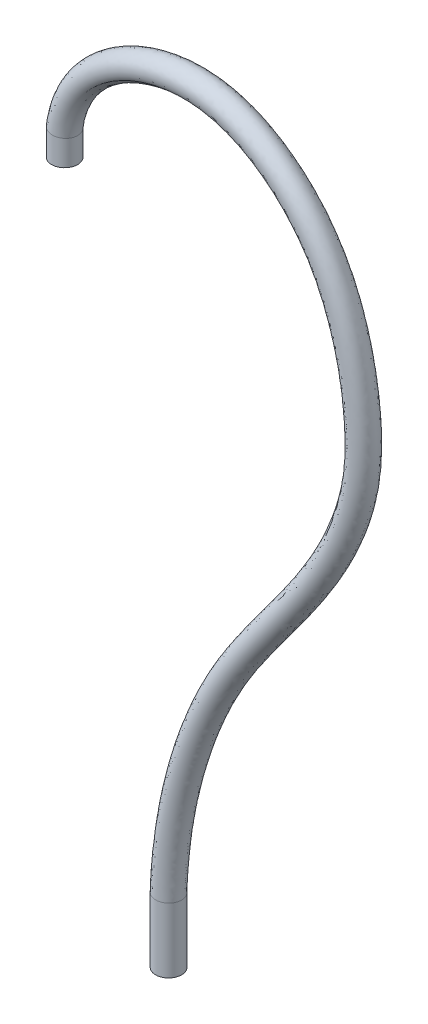
ISO-10303-21;
HEADER;
FILE_DESCRIPTION(('STEP AP214'),'2;1');
FILE_NAME('part.step','',(''),(''),'','','');
FILE_SCHEMA(('AUTOMOTIVE_DESIGN { 1 0 10303 214 1 1 1 1 }'));
ENDSEC;
DATA;
#1=APPLICATION_CONTEXT('core data for automotive mechanical design processes');
#2=APPLICATION_PROTOCOL_DEFINITION('international standard','automotive_design',2000,#1);
#3=PRODUCT_CONTEXT('',#1,'mechanical');
#4=PRODUCT('Part','Part','',(#3));
#5=PRODUCT_RELATED_PRODUCT_CATEGORY('part','',(#4));
#6=PRODUCT_DEFINITION_FORMATION('','',#4);
#7=PRODUCT_DEFINITION_CONTEXT('part definition',#1,'design');
#8=PRODUCT_DEFINITION('design','',#6,#7);
#9=PRODUCT_DEFINITION_SHAPE('','',#8);
#10=(LENGTH_UNIT() NAMED_UNIT(*) SI_UNIT(.MILLI.,.METRE.));
#11=(NAMED_UNIT(*) PLANE_ANGLE_UNIT() SI_UNIT($,.RADIAN.));
#12=(NAMED_UNIT(*) SI_UNIT($,.STERADIAN.) SOLID_ANGLE_UNIT());
#13=UNCERTAINTY_MEASURE_WITH_UNIT(LENGTH_MEASURE(1.E-05),#10,'distance_accuracy_value','');
#14=(GEOMETRIC_REPRESENTATION_CONTEXT(3) GLOBAL_UNCERTAINTY_ASSIGNED_CONTEXT((#13)) GLOBAL_UNIT_ASSIGNED_CONTEXT((#10,
#11,#12)) REPRESENTATION_CONTEXT('',''));
#15=CARTESIAN_POINT('',(0.,0.,0.));
#16=DIRECTION('',(0.,0.,1.));
#17=DIRECTION('',(1.,0.,0.));
#18=AXIS2_PLACEMENT_3D('',#15,#16,#17);
#19=CARTESIAN_POINT('',(8.,-50.,0.));
#20=DIRECTION('',(0.,-1.,0.));
#21=DIRECTION('',(0.,0.,1.));
#22=AXIS2_PLACEMENT_3D('',#19,#20,#21);
#23=PLANE('',#22);
#24=CARTESIAN_POINT('',(8.,-50.,0.));
#25=DIRECTION('',(0.,-1.,0.));
#26=DIRECTION('',(0.,0.,1.));
#27=AXIS2_PLACEMENT_3D('',#24,#25,#26);
#28=CIRCLE('',#27,1.);
#29=CARTESIAN_POINT('',(8.,-50.,1.));
#30=VERTEX_POINT('',#29);
#31=EDGE_CURVE('E42',#30,#30,#28,.T.);
#32=ORIENTED_EDGE('',*,*,#31,.T.);
#33=EDGE_LOOP('',(#32));
#34=FACE_BOUND('',#33,.T.);
#35=ADVANCED_FACE('F39',(#34),#23,.T.);
#36=CARTESIAN_POINT('',(0.,0.,0.));
#37=DIRECTION('',(0.,1.,0.));
#38=DIRECTION('',(0.,0.,1.));
#39=AXIS2_PLACEMENT_3D('',#36,#37,#38);
#40=PLANE('',#39);
#41=CARTESIAN_POINT('',(0.,0.,0.));
#42=DIRECTION('',(0.,1.,0.));
#43=DIRECTION('',(0.,0.,1.));
#44=AXIS2_PLACEMENT_3D('',#41,#42,#43);
#45=CIRCLE('',#44,1.);
#46=CARTESIAN_POINT('',(0.,0.,1.));
#47=VERTEX_POINT('',#46);
#48=EDGE_CURVE('E72',#47,#47,#45,.T.);
#49=ORIENTED_EDGE('',*,*,#48,.F.);
#50=EDGE_LOOP('',(#49));
#51=FACE_BOUND('',#50,.T.);
#52=ADVANCED_FACE('F129',(#51),#40,.F.);
#53=CARTESIAN_POINT('',(8.,-44.8,0.));
#54=DIRECTION('',(0.,-1.,0.));
#55=DIRECTION('',(0.,0.,-1.));
#56=AXIS2_PLACEMENT_3D('',#53,#54,#55);
#57=CYLINDRICAL_SURFACE('',#56,1.);
#58=CARTESIAN_POINT('',(8.,-45.,1.));
#59=CARTESIAN_POINT('',(7.98805481461004,-44.9998140617509,1.00000165148446));
#60=CARTESIAN_POINT('',(7.97610338253314,-44.9996280264795,0.999787081348416));
#61=CARTESIAN_POINT('',(7.90806474949074,-44.9985689424073,0.997340093052473));
#62=CARTESIAN_POINT('',(7.85204433235093,-44.9976969375508,0.990581500069308));
#63=CARTESIAN_POINT('',(7.76950194526793,-44.9964121022962,0.973482363838396));
#64=CARTESIAN_POINT('',(7.74219800479639,-44.9959870967062,0.966607655404486));
#65=CARTESIAN_POINT('',(7.68823970496654,-44.9951471987255,0.95057746785115));
#66=CARTESIAN_POINT('',(7.6615858925841,-44.9947323148506,0.941420136329535));
#67=CARTESIAN_POINT('',(7.58302341751744,-44.9935094417863,0.910650575818504));
#68=CARTESIAN_POINT('',(7.53237427841093,-44.9927210606928,0.885711744000511));
#69=CARTESIAN_POINT('',(7.43600570680112,-44.9912210380202,0.827694263162769));
#70=CARTESIAN_POINT('',(7.39028645275961,-44.9905093992193,0.79461531961325));
#71=CARTESIAN_POINT('',(7.30504919930706,-44.989182651144,0.721251079430236));
#72=CARTESIAN_POINT('',(7.26553039235925,-44.9885675292994,0.680966722683669));
#73=CARTESIAN_POINT('',(7.19381459217932,-44.987451254809,0.594330153932255));
#74=CARTESIAN_POINT('',(7.16161837757424,-44.9869501142832,0.547977297475663));
#75=CARTESIAN_POINT('',(7.10547001872057,-44.9860761555701,0.450530275803133));
#76=CARTESIAN_POINT('',(7.08151654302461,-44.9857033166584,0.399436878019983));
#77=CARTESIAN_POINT('',(7.04252793180941,-44.9850964546881,0.293953969625149));
#78=CARTESIAN_POINT('',(7.02749264448783,-44.9848624292668,0.23956451513519));
#79=CARTESIAN_POINT('',(7.00676779554279,-44.9845398455239,0.129038228212518));
#80=CARTESIAN_POINT('',(7.00107733950231,-44.9844512732806,0.0729015635337563));
#81=CARTESIAN_POINT('',(6.99920108791111,-44.9844220693183,-0.0395304363150781));
#82=CARTESIAN_POINT('',(7.00301529393838,-44.9844814376237,-0.0958257715114917));
#83=CARTESIAN_POINT('',(7.02003945836991,-44.9847464198699,-0.206973646647821));
#84=CARTESIAN_POINT('',(7.03324887367382,-44.9849520253572,-0.261826269795236));
#85=CARTESIAN_POINT('',(7.06868822357359,-44.9855036423591,-0.368536496549264));
#86=CARTESIAN_POINT('',(7.09091837568119,-44.9858496572592,-0.420394027902537));
#87=CARTESIAN_POINT('',(7.1437701108498,-44.9866723027374,-0.519646003420861));
#88=CARTESIAN_POINT('',(7.17439259574509,-44.9871489473528,-0.567039967198166));
#89=CARTESIAN_POINT('',(7.24315433087011,-44.9882192398369,-0.656006340521134));
#90=CARTESIAN_POINT('',(7.28129227637592,-44.9888128673968,-0.697579758404735));
#91=CARTESIAN_POINT('',(7.36400817045119,-44.9901003678044,-0.773742477416914));
#92=CARTESIAN_POINT('',(7.40858774381729,-44.9907942659439,-0.808330011175433));
#93=CARTESIAN_POINT('',(7.50294900118573,-44.9922630414151,-0.869539990287673));
#94=CARTESIAN_POINT('',(7.5527312364656,-44.9930379273285,-0.896161590408816));
#95=CARTESIAN_POINT('',(7.63279582548675,-44.9942841794463,-0.930657164096869));
#96=CARTESIAN_POINT('',(7.66179961957667,-44.9947356415661,-0.941582319051211));
#97=CARTESIAN_POINT('',(7.72066380072263,-44.9956519016473,-0.960692259162903));
#98=CARTESIAN_POINT('',(7.75052350046273,-44.9961166889083,-0.968879179774275));
#99=CARTESIAN_POINT('',(7.84093545232383,-44.9975240185615,-0.989187675282089));
#100=CARTESIAN_POINT('',(7.90251145145315,-44.9984825002033,-0.997138991959235));
#101=CARTESIAN_POINT('',(7.97610403076557,-44.9996280365702,-0.999787371859265));
#102=CARTESIAN_POINT('',(7.98805547934945,-44.9998140720989,-1.00000197221012));
#103=CARTESIAN_POINT('',(8.,-45.0000000000019,-1.));
#104=B_SPLINE_CURVE_WITH_KNOTS('',3,(#58,#59,#60,#61,#62,#63,#64,#65,#66,#67,#68,#69,#70,#71,
#72,#73,#74,#75,#76,#77,#78,#79,#80,#81,#82,#83,#84,#85,#86,#87,#88,#89,#90,#91,#92,#93,#94,#95,
#96,#97,#98,#99,#100,#101,#102,#103),.UNSPECIFIED.,.F.,.F.,(4,2,2,2,2,2,2,2,2,2,2,2,2,2,2,2,2,2,
2,2,2,2,4),(0.,0.0358549768613409,0.20417400548127,0.288574467277851,0.373043646297481,
0.54156014186658,0.710082735684229,0.878583363124709,1.04710189923227,1.21559320179453,
1.38408163627292,1.55255394336417,1.72102627842559,1.88948887555068,2.05795553495712,
2.22644030477775,2.39489585047393,2.56339396077412,2.73190994338379,2.82477657315231,
2.91757060966215,3.10254423959273,3.13839921645405),.UNSPECIFIED.);
#105=CARTESIAN_POINT('',(8.,-45.0000000000019,-1.));
#106=VERTEX_POINT('',#105);
#107=CARTESIAN_POINT('',(8.,-45.,1.));
#108=VERTEX_POINT('',#107);
#109=EDGE_CURVE('E63',#106,#108,#104,.F.);
#110=ORIENTED_EDGE('',*,*,#109,.F.);
#111=CARTESIAN_POINT('',(8.,-45.,1.));
#112=CARTESIAN_POINT('',(8.01194518542314,-45.0001859373805,1.00000165147832));
#113=CARTESIAN_POINT('',(8.0238966167728,-45.0003720187773,0.999787081344606));
#114=CARTESIAN_POINT('',(8.09193537001394,-45.0014316301983,0.997340088888409));
#115=CARTESIAN_POINT('',(8.14795589262842,-45.0023050867706,0.990581471675548));
#116=CARTESIAN_POINT('',(8.23049841070236,-45.0035934938564,0.973482280923822));
#117=CARTESIAN_POINT('',(8.25780239060565,-45.0040199254693,0.966607551138434));
#118=CARTESIAN_POINT('',(8.31176076092567,-45.0048630971601,0.950577316241468));
#119=CARTESIAN_POINT('',(8.33841460436052,-45.0052798290647,0.941419958726742));
#120=CARTESIAN_POINT('',(8.41697715720728,-45.006508795508,0.91065031682549));
#121=CARTESIAN_POINT('',(8.46762633196894,-45.0073019777447,0.885711425241722));
#122=CARTESIAN_POINT('',(8.5639949549771,-45.008812535628,0.827693815970666));
#123=CARTESIAN_POINT('',(8.60971422475939,-45.0095299085302,0.794614803750466));
#124=CARTESIAN_POINT('',(8.69495153772968,-45.010868410939,0.721250377821417));
#125=CARTESIAN_POINT('',(8.73447038249966,-45.0114895528861,0.680965897068476));
#126=CARTESIAN_POINT('',(8.80618622946308,-45.0126174778433,0.594329050850721));
#127=CARTESIAN_POINT('',(8.83838245307585,-45.0131242486927,0.547976040971881));
#128=CARTESIAN_POINT('',(8.89453074764769,-45.0140084463238,0.450528760674803));
#129=CARTESIAN_POINT('',(8.9184841628689,-45.0143858941958,0.399435265076509));
#130=CARTESIAN_POINT('',(8.95747263026617,-45.0150004404644,0.293952152093126));
#131=CARTESIAN_POINT('',(8.97250783441286,-45.0152375412525,0.239562590891998));
#132=CARTESIAN_POINT('',(8.99323245469438,-45.0155643990917,0.129036263982315));
#133=CARTESIAN_POINT('',(8.99892279400049,-45.0156541706973,0.0728996714198654));
#134=CARTESIAN_POINT('',(9.00079883904247,-45.0156837652316,-0.039532167168209));
#135=CARTESIAN_POINT('',(8.99698454332149,-45.0156235881373,-0.0958274132181504));
#136=CARTESIAN_POINT('',(8.97996024643171,-45.0153550702976,-0.206974994758923));
#137=CARTESIAN_POINT('',(8.96675080444664,-45.0151467383702,-0.261827415922853));
#138=CARTESIAN_POINT('',(8.9313114726738,-45.0145880540145,-0.368537234237228));
#139=CARTESIAN_POINT('',(8.90908136533917,-45.0142376981611,-0.420394559121982));
#140=CARTESIAN_POINT('',(8.8562297622477,-45.013405238977,-0.51964619685407));
#141=CARTESIAN_POINT('',(8.82560735417795,-45.0129231213227,-0.567040023728984));
#142=CARTESIAN_POINT('',(8.75684582665658,-45.0118413639366,-0.656006144965132));
#143=CARTESIAN_POINT('',(8.7187080117253,-45.0112417446007,-0.697579447510754));
#144=CARTESIAN_POINT('',(8.63599221387168,-45.0099424084731,-0.773742169193506));
#145=CARTESIAN_POINT('',(8.59141257390846,-45.0092426659268,-0.80832978588598));
#146=CARTESIAN_POINT('',(8.49705115977489,-45.0077630105988,-0.869539905044896));
#147=CARTESIAN_POINT('',(8.44726883428902,-45.0069830893208,-0.896161562221527));
#148=CARTESIAN_POINT('',(8.36720415519657,-45.0057301038672,-0.930657171151228));
#149=CARTESIAN_POINT('',(8.3382003739595,-45.0052764608684,-0.941582321020394));
#150=CARTESIAN_POINT('',(8.27933621307339,-45.0043563318823,-0.960692254813463));
#151=CARTESIAN_POINT('',(8.24947652074768,-45.0038898562116,-0.968879174197902));
#152=CARTESIAN_POINT('',(8.15906458040834,-45.0024783041028,-0.989187669539582));
#153=CARTESIAN_POINT('',(8.09748857367861,-45.001518114485,-0.997138991237222));
#154=CARTESIAN_POINT('',(8.02389596855879,-45.0003720085532,-0.99978737184792));
#155=CARTESIAN_POINT('',(8.01194452070349,-45.0001859268801,-1.00000197219544));
#156=CARTESIAN_POINT('',(8.,-45.0000000000019,-1.));
#157=B_SPLINE_CURVE_WITH_KNOTS('',3,(#111,#112,#113,#114,#115,#116,#117,#118,#119,#120,#121,
#122,#123,#124,#125,#126,#127,#128,#129,#130,#131,#132,#133,#134,#135,#136,#137,#138,#139,#140,
#141,#142,#143,#144,#145,#146,#147,#148,#149,#150,#151,#152,#153,#154,#155,#156),.UNSPECIFIED.,
.F.,.F.,(4,2,2,2,2,2,2,2,2,2,2,2,2,2,2,2,2,2,2,2,2,2,4),(0.,0.0358549768602243,
0.204174390891306,0.288575047660511,0.373044421707198,0.541561293973049,0.710084264559417,
0.878585430756969,1.04710450454294,1.21559608268947,1.38408478957551,1.55255685060353,
1.72102893745486,1.88949099796246,2.05795712142647,2.22644156582868,2.39489679051027,
2.56339542458947,2.73191193218545,2.82477861654628,2.91757270728109,3.10254644171763,
3.13840141857784),.UNSPECIFIED.);
#158=EDGE_CURVE('E65',#106,#108,#157,.F.);
#159=ORIENTED_EDGE('',*,*,#158,.T.);
#160=EDGE_LOOP('',(#110,#159));
#161=FACE_BOUND('',#160,.T.);
#162=ORIENTED_EDGE('',*,*,#31,.F.);
#163=EDGE_LOOP('',(#162));
#164=FACE_BOUND('',#163,.T.);
#165=ADVANCED_FACE('F66',(#161,#164),#57,.T.);
#166=CARTESIAN_POINT('',(-0.0306229319689422,1.76137151981467,1.));
#167=CARTESIAN_POINT('',(-0.0204152879792942,1.84091434654313,1.));
#168=CARTESIAN_POINT('',(-0.0102100034091478,1.92045814668702,1.));
#169=CARTESIAN_POINT('',(0.0212547068439375,2.16558650435672,1.));
#170=CARTESIAN_POINT('',(0.047419682039352,2.32914728727976,1.));
#171=CARTESIAN_POINT('',(0.109246799790766,2.652091005692,1.));
#172=CARTESIAN_POINT('',(0.144904031832794,2.81147596798519,1.));
#173=CARTESIAN_POINT('',(0.265577485650926,3.28319879424991,1.));
#174=CARTESIAN_POINT('',(0.364295469577643,3.58910459904989,1.));
#175=CARTESIAN_POINT('',(0.711022397210815,4.47972282478102,1.));
#176=CARTESIAN_POINT('',(1.00960432599683,5.03733606002943,1.));
#177=CARTESIAN_POINT('',(2.07376955109829,6.59081143322531,1.));
#178=CARTESIAN_POINT('',(3.00777230508657,7.46730924474106,1.));
#179=CARTESIAN_POINT('',(6.21247855286938,9.53160470927009,1.));
#180=CARTESIAN_POINT('',(8.88588006889423,10.1542044021796,1.));
#181=CARTESIAN_POINT('',(12.8325925278302,9.57518327519314,1.));
#182=CARTESIAN_POINT('',(14.2277189977555,9.02145276159828,1.));
#183=CARTESIAN_POINT('',(16.7602734648448,7.44947859842006,1.));
#184=CARTESIAN_POINT('',(17.8977014683981,6.43123493983376,1.));
#185=CARTESIAN_POINT('',(21.1504711774338,2.4908213511582,1.));
#186=CARTESIAN_POINT('',(22.2988215651818,-1.05410786993432,1.));
#187=CARTESIAN_POINT('',(23.0026577057096,-6.33399612996956,1.));
#188=CARTESIAN_POINT('',(23.077126577792,-8.04582177217757,1.));
#189=CARTESIAN_POINT('',(22.4333647161719,-13.0736579630502,1.));
#190=CARTESIAN_POINT('',(20.8394202602341,-16.2653874038234,1.));
#191=CARTESIAN_POINT('',(16.9668331568098,-22.171302539669,1.));
#192=CARTESIAN_POINT('',(14.6624665428578,-24.860100377207,1.));
#193=CARTESIAN_POINT('',(11.3359405010715,-30.4474380385006,1.));
#194=CARTESIAN_POINT('',(10.1681203185673,-33.244563219975,1.));
#195=CARTESIAN_POINT('',(8.95167828380848,-37.5924654184224,1.));
#196=CARTESIAN_POINT('',(8.63541231175747,-39.0671352233303,1.));
#197=CARTESIAN_POINT('',(8.29580078170953,-41.2903064226676,1.));
#198=CARTESIAN_POINT('',(8.20506150967735,-42.0332245717703,1.));
#199=CARTESIAN_POINT('',(8.06867300307515,-43.5183018479195,1.));
#200=CARTESIAN_POINT('',(8.02302886501342,-44.2604603856005,1.));
#201=CARTESIAN_POINT('',(7.99792503959598,-45.0666344353569,1.));
#202=CARTESIAN_POINT('',(7.99585099761325,-45.13326876437,1.));
#203=CARTESIAN_POINT('',(7.99377649641968,-45.1999031465565,1.));
#204=CARTESIAN_POINT('',(1.95310941182559,1.50680131695611,1.));
#205=CARTESIAN_POINT('',(1.96331705581524,1.58634414368455,1.));
#206=CARTESIAN_POINT('',(1.97477755717229,1.67566443229557,1.));
#207=CARTESIAN_POINT('',(2.0023739991279,1.890664065754,1.));
#208=CARTESIAN_POINT('',(2.01944818284606,1.99331704436174,1.));
#209=CARTESIAN_POINT('',(2.06586865393284,2.23578669378566,1.));
#210=CARTESIAN_POINT('',(2.0925997304692,2.35525327119271,1.));
#211=CARTESIAN_POINT('',(2.1830018023211,2.70864268288023,1.));
#212=CARTESIAN_POINT('',(2.2568674407412,2.93757894586335,1.));
#213=CARTESIAN_POINT('',(2.5171100085068,3.60604959328318,1.));
#214=CARTESIAN_POINT('',(2.74219005962151,4.02762980030223,1.));
#215=CARTESIAN_POINT('',(3.55856830395016,5.2193841127417,1.));
#216=CARTESIAN_POINT('',(4.29466017941635,5.91724109761524,1.));
#217=CARTESIAN_POINT('',(6.8878434752451,7.58762711703736,1.));
#218=CARTESIAN_POINT('',(9.1223603805899,8.09810128152666,1.));
#219=CARTESIAN_POINT('',(12.2333286727273,7.64169195734007,1.));
#220=CARTESIAN_POINT('',(13.3746160997315,7.19702374004102,1.));
#221=CARTESIAN_POINT('',(15.5038824791974,5.87537329548496,1.));
#222=CARTESIAN_POINT('',(16.4864341300938,4.99919463351919,1.));
#223=CARTESIAN_POINT('',(19.2872455542616,1.60628447283399,1.));
#224=CARTESIAN_POINT('',(20.349084240438,-1.56387582606753,1.));
#225=CARTESIAN_POINT('',(21.0045862122346,-6.48118109767011,1.));
#226=CARTESIAN_POINT('',(21.0640430630053,-8.02048613156399,1.));
#227=CARTESIAN_POINT('',(20.5083830507365,-12.3602392100134,1.));
#228=CARTESIAN_POINT('',(19.0787329794664,-15.3031812679251,1.));
#229=CARTESIAN_POINT('',(15.3861736451532,-20.9345438369283,1.));
#230=CARTESIAN_POINT('',(13.0607065618377,-23.6409083752467,1.));
#231=CARTESIAN_POINT('',(9.51929576984431,-29.5891732153839,1.));
#232=CARTESIAN_POINT('',(8.2863608967651,-32.5474322845738,1.));
#233=CARTESIAN_POINT('',(7.00349854688533,-37.1327391646898,1.));
#234=CARTESIAN_POINT('',(6.67042707355036,-38.6860419338211,1.));
#235=CARTESIAN_POINT('',(6.31269586185977,-41.0278285239878,1.));
#236=CARTESIAN_POINT('',(6.21710867839955,-41.8104015099355,1.));
#237=CARTESIAN_POINT('',(6.07338879483753,-43.375307076629,1.));
#238=CARTESIAN_POINT('',(6.02462944789715,-44.1779324775329,1.));
#239=CARTESIAN_POINT('',(5.99883662482826,-45.0062278399223,1.));
#240=CARTESIAN_POINT('',(5.99681953204835,-45.0710337285668,1.));
#241=CARTESIAN_POINT('',(5.99474503085478,-45.1376681107533,1.));
#242=CARTESIAN_POINT('',(1.95310941182559,1.50680131695611,-1.));
#243=CARTESIAN_POINT('',(1.96331705581524,1.58634414368455,-1.));
#244=CARTESIAN_POINT('',(1.97477755717229,1.67566443229557,-1.));
#245=CARTESIAN_POINT('',(2.0023739991279,1.890664065754,-1.));
#246=CARTESIAN_POINT('',(2.01944818284606,1.99331704436174,-1.));
#247=CARTESIAN_POINT('',(2.06586865393284,2.23578669378566,-1.));
#248=CARTESIAN_POINT('',(2.0925997304692,2.35525327119271,-1.));
#249=CARTESIAN_POINT('',(2.1830018023211,2.70864268288023,-1.));
#250=CARTESIAN_POINT('',(2.2568674407412,2.93757894586335,-1.));
#251=CARTESIAN_POINT('',(2.5171100085068,3.60604959328318,-1.));
#252=CARTESIAN_POINT('',(2.74219005962151,4.02762980030223,-1.));
#253=CARTESIAN_POINT('',(3.55856830395016,5.2193841127417,-1.));
#254=CARTESIAN_POINT('',(4.29466017941635,5.91724109761524,-1.));
#255=CARTESIAN_POINT('',(6.8878434752451,7.58762711703736,-1.));
#256=CARTESIAN_POINT('',(9.1223603805899,8.09810128152666,-1.));
#257=CARTESIAN_POINT('',(12.2333286727273,7.64169195734007,-1.));
#258=CARTESIAN_POINT('',(13.3746160997315,7.19702374004102,-1.));
#259=CARTESIAN_POINT('',(15.5038824791974,5.87537329548496,-1.));
#260=CARTESIAN_POINT('',(16.4864341300938,4.99919463351919,-1.));
#261=CARTESIAN_POINT('',(19.2872455542616,1.60628447283399,-1.));
#262=CARTESIAN_POINT('',(20.349084240438,-1.56387582606753,-1.));
#263=CARTESIAN_POINT('',(21.0045862122346,-6.48118109767011,-1.));
#264=CARTESIAN_POINT('',(21.0640430630053,-8.02048613156399,-1.));
#265=CARTESIAN_POINT('',(20.5083830507365,-12.3602392100134,-1.));
#266=CARTESIAN_POINT('',(19.0787329794664,-15.3031812679251,-1.));
#267=CARTESIAN_POINT('',(15.3861736451532,-20.9345438369283,-1.));
#268=CARTESIAN_POINT('',(13.0607065618377,-23.6409083752467,-1.));
#269=CARTESIAN_POINT('',(9.51929576984431,-29.5891732153839,-1.));
#270=CARTESIAN_POINT('',(8.2863608967651,-32.5474322845738,-1.));
#271=CARTESIAN_POINT('',(7.00349854688533,-37.1327391646898,-1.));
#272=CARTESIAN_POINT('',(6.67042707355036,-38.6860419338211,-1.));
#273=CARTESIAN_POINT('',(6.31269586185977,-41.0278285239878,-1.));
#274=CARTESIAN_POINT('',(6.21710867839955,-41.8104015099355,-1.));
#275=CARTESIAN_POINT('',(6.07338879483753,-43.375307076629,-1.));
#276=CARTESIAN_POINT('',(6.02462944789715,-44.1779324775329,-1.));
#277=CARTESIAN_POINT('',(5.99883662482826,-45.0062278399223,-1.));
#278=CARTESIAN_POINT('',(5.99681953204835,-45.0710337285668,-1.));
#279=CARTESIAN_POINT('',(5.99474503085478,-45.1376681107533,-1.));
#280=CARTESIAN_POINT('',(-0.0306229319689421,1.76137151981467,-1.));
#281=CARTESIAN_POINT('',(-0.0204152879792941,1.84091434654313,-1.));
#282=CARTESIAN_POINT('',(-0.0102100034091477,1.92045814668702,-1.));
#283=CARTESIAN_POINT('',(0.0212547068439376,2.16558650435672,-1.));
#284=CARTESIAN_POINT('',(0.0474196820393522,2.32914728727976,-1.));
#285=CARTESIAN_POINT('',(0.109246799790766,2.652091005692,-1.));
#286=CARTESIAN_POINT('',(0.144904031832794,2.81147596798519,-1.));
#287=CARTESIAN_POINT('',(0.265577485650927,3.28319879424991,-1.));
#288=CARTESIAN_POINT('',(0.364295469577643,3.58910459904989,-1.));
#289=CARTESIAN_POINT('',(0.711022397210815,4.47972282478102,-1.));
#290=CARTESIAN_POINT('',(1.00960432599683,5.03733606002943,-1.));
#291=CARTESIAN_POINT('',(2.07376955109829,6.59081143322531,-1.));
#292=CARTESIAN_POINT('',(3.00777230508657,7.46730924474106,-1.));
#293=CARTESIAN_POINT('',(6.21247855286938,9.53160470927009,-1.));
#294=CARTESIAN_POINT('',(8.88588006889423,10.1542044021796,-1.));
#295=CARTESIAN_POINT('',(12.8325925278302,9.57518327519314,-1.));
#296=CARTESIAN_POINT('',(14.2277189977555,9.02145276159828,-1.));
#297=CARTESIAN_POINT('',(16.7602734648448,7.44947859842006,-1.));
#298=CARTESIAN_POINT('',(17.8977014683981,6.43123493983376,-1.));
#299=CARTESIAN_POINT('',(21.1504711774338,2.4908213511582,-1.));
#300=CARTESIAN_POINT('',(22.2988215651818,-1.05410786993432,-1.));
#301=CARTESIAN_POINT('',(23.0026577057096,-6.33399612996956,-1.));
#302=CARTESIAN_POINT('',(23.077126577792,-8.04582177217757,-1.));
#303=CARTESIAN_POINT('',(22.4333647161719,-13.0736579630502,-1.));
#304=CARTESIAN_POINT('',(20.8394202602341,-16.2653874038234,-1.));
#305=CARTESIAN_POINT('',(16.9668331568098,-22.171302539669,-1.));
#306=CARTESIAN_POINT('',(14.6624665428578,-24.860100377207,-1.));
#307=CARTESIAN_POINT('',(11.3359405010715,-30.4474380385006,-1.));
#308=CARTESIAN_POINT('',(10.1681203185673,-33.244563219975,-1.));
#309=CARTESIAN_POINT('',(8.95167828380848,-37.5924654184224,-1.));
#310=CARTESIAN_POINT('',(8.63541231175747,-39.0671352233303,-1.));
#311=CARTESIAN_POINT('',(8.29580078170953,-41.2903064226676,-1.));
#312=CARTESIAN_POINT('',(8.20506150967735,-42.0332245717703,-1.));
#313=CARTESIAN_POINT('',(8.06867300307515,-43.5183018479195,-1.));
#314=CARTESIAN_POINT('',(8.02302886501342,-44.2604603856005,-1.));
#315=CARTESIAN_POINT('',(7.99792503959598,-45.0666344353569,-1.));
#316=CARTESIAN_POINT('',(7.99585099761325,-45.13326876437,-1.));
#317=CARTESIAN_POINT('',(7.99377649641968,-45.1999031465565,-1.));
#318=CARTESIAN_POINT('',(-2.01435527576347,2.01594172267323,-1.));
#319=CARTESIAN_POINT('',(-2.00414763177383,2.0954845494017,-1.));
#320=CARTESIAN_POINT('',(-1.99519756399058,2.16525186107847,-1.));
#321=CARTESIAN_POINT('',(-1.95986458544002,2.44050894295944,-1.));
#322=CARTESIAN_POINT('',(-1.92460881876735,2.66497753019778,-1.));
#323=CARTESIAN_POINT('',(-1.8473750543513,3.06839531759835,-1.));
#324=CARTESIAN_POINT('',(-1.80279166680362,3.26769866477767,-1.));
#325=CARTESIAN_POINT('',(-1.65184683101925,3.8577549056196,-1.));
#326=CARTESIAN_POINT('',(-1.52827650158592,4.24063025223643,-1.));
#327=CARTESIAN_POINT('',(-1.09506521408517,5.35339605627886,-1.));
#328=CARTESIAN_POINT('',(-0.722981407627861,6.04704231975663,-1.));
#329=CARTESIAN_POINT('',(0.588970798246424,7.96223875370893,-1.));
#330=CARTESIAN_POINT('',(1.72088443075678,9.01737739186687,-1.));
#331=CARTESIAN_POINT('',(5.53711363049366,11.4755823015028,-1.));
#332=CARTESIAN_POINT('',(8.64939975719857,12.2103075228325,-1.));
#333=CARTESIAN_POINT('',(13.4318563829331,11.5086745930462,-1.));
#334=CARTESIAN_POINT('',(15.0808218957795,10.8458817831555,-1.));
#335=CARTESIAN_POINT('',(18.0166644504923,9.02358390135516,-1.));
#336=CARTESIAN_POINT('',(19.3089688067024,7.86327524614832,-1.));
#337=CARTESIAN_POINT('',(23.0136968006059,3.37535822948241,-1.));
#338=CARTESIAN_POINT('',(24.2485588899256,-0.544339913801108,-1.));
#339=CARTESIAN_POINT('',(25.0007291991846,-6.18681116226901,-1.));
#340=CARTESIAN_POINT('',(25.0902100925788,-8.07115741279116,-1.));
#341=CARTESIAN_POINT('',(24.3583463816072,-13.787076716087,-1.));
#342=CARTESIAN_POINT('',(22.6001075410019,-17.2275935397217,-1.));
#343=CARTESIAN_POINT('',(18.5474926684663,-23.4080612424097,-1.));
#344=CARTESIAN_POINT('',(16.2642265238779,-26.0792923791672,-1.));
#345=CARTESIAN_POINT('',(13.1525852322986,-31.3057028616173,-1.));
#346=CARTESIAN_POINT('',(12.0498797403695,-33.9416941553763,-1.));
#347=CARTESIAN_POINT('',(10.8998580207316,-38.052191672155,-1.));
#348=CARTESIAN_POINT('',(10.6003975499646,-39.4482285128396,-1.));
#349=CARTESIAN_POINT('',(10.2789057015593,-41.5527843213475,-1.));
#350=CARTESIAN_POINT('',(10.1930143409551,-42.2560476336051,-1.));
#351=CARTESIAN_POINT('',(10.0639572113128,-43.6612966192099,-1.));
#352=CARTESIAN_POINT('',(10.0214282821297,-44.3429882936681,-1.));
#353=CARTESIAN_POINT('',(9.99701345436371,-45.1270410307916,-1.));
#354=CARTESIAN_POINT('',(9.99488246317816,-45.1955038001731,-1.));
#355=CARTESIAN_POINT('',(9.99280796198459,-45.2621381823597,-1.));
#356=CARTESIAN_POINT('',(-2.01435527576347,2.01594172267323,1.));
#357=CARTESIAN_POINT('',(-2.00414763177383,2.0954845494017,1.));
#358=CARTESIAN_POINT('',(-1.99519756399058,2.16525186107847,1.));
#359=CARTESIAN_POINT('',(-1.95986458544002,2.44050894295944,1.));
#360=CARTESIAN_POINT('',(-1.92460881876735,2.66497753019778,1.));
#361=CARTESIAN_POINT('',(-1.8473750543513,3.06839531759835,1.));
#362=CARTESIAN_POINT('',(-1.80279166680362,3.26769866477767,1.));
#363=CARTESIAN_POINT('',(-1.65184683101925,3.8577549056196,1.));
#364=CARTESIAN_POINT('',(-1.52827650158592,4.24063025223643,1.));
#365=CARTESIAN_POINT('',(-1.09506521408517,5.35339605627886,1.));
#366=CARTESIAN_POINT('',(-0.722981407627861,6.04704231975663,1.));
#367=CARTESIAN_POINT('',(0.588970798246424,7.96223875370893,1.));
#368=CARTESIAN_POINT('',(1.72088443075678,9.01737739186687,1.));
#369=CARTESIAN_POINT('',(5.53711363049366,11.4755823015028,1.));
#370=CARTESIAN_POINT('',(8.64939975719857,12.2103075228325,1.));
#371=CARTESIAN_POINT('',(13.4318563829331,11.5086745930462,1.));
#372=CARTESIAN_POINT('',(15.0808218957795,10.8458817831555,1.));
#373=CARTESIAN_POINT('',(18.0166644504923,9.02358390135516,1.));
#374=CARTESIAN_POINT('',(19.3089688067024,7.86327524614832,1.));
#375=CARTESIAN_POINT('',(23.0136968006059,3.37535822948241,1.));
#376=CARTESIAN_POINT('',(24.2485588899256,-0.544339913801108,1.));
#377=CARTESIAN_POINT('',(25.0007291991846,-6.18681116226901,1.));
#378=CARTESIAN_POINT('',(25.0902100925788,-8.07115741279116,1.));
#379=CARTESIAN_POINT('',(24.3583463816072,-13.787076716087,1.));
#380=CARTESIAN_POINT('',(22.6001075410019,-17.2275935397217,1.));
#381=CARTESIAN_POINT('',(18.5474926684663,-23.4080612424097,1.));
#382=CARTESIAN_POINT('',(16.2642265238779,-26.0792923791672,1.));
#383=CARTESIAN_POINT('',(13.1525852322986,-31.3057028616173,1.));
#384=CARTESIAN_POINT('',(12.0498797403695,-33.9416941553763,1.));
#385=CARTESIAN_POINT('',(10.8998580207316,-38.052191672155,1.));
#386=CARTESIAN_POINT('',(10.6003975499646,-39.4482285128396,1.));
#387=CARTESIAN_POINT('',(10.2789057015593,-41.5527843213475,1.));
#388=CARTESIAN_POINT('',(10.1930143409551,-42.2560476336051,1.));
#389=CARTESIAN_POINT('',(10.0639572113128,-43.6612966192099,1.));
#390=CARTESIAN_POINT('',(10.0214282821297,-44.3429882936681,1.));
#391=CARTESIAN_POINT('',(9.99701345436371,-45.1270410307916,1.));
#392=CARTESIAN_POINT('',(9.99488246317816,-45.1955038001731,1.));
#393=CARTESIAN_POINT('',(9.99280796198459,-45.2621381823597,1.));
#394=CARTESIAN_POINT('',(-0.0306229319689422,1.76137151981467,1.));
#395=CARTESIAN_POINT('',(-0.0204152879792942,1.84091434654313,1.));
#396=CARTESIAN_POINT('',(-0.0102100034091478,1.92045814668702,1.));
#397=CARTESIAN_POINT('',(0.0212547068439375,2.16558650435672,1.));
#398=CARTESIAN_POINT('',(0.047419682039352,2.32914728727976,1.));
#399=CARTESIAN_POINT('',(0.109246799790766,2.652091005692,1.));
#400=CARTESIAN_POINT('',(0.144904031832794,2.81147596798519,1.));
#401=CARTESIAN_POINT('',(0.265577485650926,3.28319879424991,1.));
#402=CARTESIAN_POINT('',(0.364295469577643,3.58910459904989,1.));
#403=CARTESIAN_POINT('',(0.711022397210815,4.47972282478102,1.));
#404=CARTESIAN_POINT('',(1.00960432599683,5.03733606002943,1.));
#405=CARTESIAN_POINT('',(2.07376955109829,6.59081143322531,1.));
#406=CARTESIAN_POINT('',(3.00777230508657,7.46730924474106,1.));
#407=CARTESIAN_POINT('',(6.21247855286938,9.53160470927009,1.));
#408=CARTESIAN_POINT('',(8.88588006889423,10.1542044021796,1.));
#409=CARTESIAN_POINT('',(12.8325925278302,9.57518327519314,1.));
#410=CARTESIAN_POINT('',(14.2277189977555,9.02145276159828,1.));
#411=CARTESIAN_POINT('',(16.7602734648448,7.44947859842006,1.));
#412=CARTESIAN_POINT('',(17.8977014683981,6.43123493983376,1.));
#413=CARTESIAN_POINT('',(21.1504711774338,2.4908213511582,1.));
#414=CARTESIAN_POINT('',(22.2988215651818,-1.05410786993432,1.));
#415=CARTESIAN_POINT('',(23.0026577057096,-6.33399612996956,1.));
#416=CARTESIAN_POINT('',(23.077126577792,-8.04582177217757,1.));
#417=CARTESIAN_POINT('',(22.4333647161719,-13.0736579630502,1.));
#418=CARTESIAN_POINT('',(20.8394202602341,-16.2653874038234,1.));
#419=CARTESIAN_POINT('',(16.9668331568098,-22.171302539669,1.));
#420=CARTESIAN_POINT('',(14.6624665428578,-24.860100377207,1.));
#421=CARTESIAN_POINT('',(11.3359405010715,-30.4474380385006,1.));
#422=CARTESIAN_POINT('',(10.1681203185673,-33.244563219975,1.));
#423=CARTESIAN_POINT('',(8.95167828380848,-37.5924654184224,1.));
#424=CARTESIAN_POINT('',(8.63541231175747,-39.0671352233303,1.));
#425=CARTESIAN_POINT('',(8.29580078170953,-41.2903064226676,1.));
#426=CARTESIAN_POINT('',(8.20506150967735,-42.0332245717703,1.));
#427=CARTESIAN_POINT('',(8.06867300307515,-43.5183018479195,1.));
#428=CARTESIAN_POINT('',(8.02302886501342,-44.2604603856005,1.));
#429=CARTESIAN_POINT('',(7.99792503959598,-45.0666344353569,1.));
#430=CARTESIAN_POINT('',(7.99585099761325,-45.13326876437,1.));
#431=CARTESIAN_POINT('',(7.99377649641968,-45.1999031465565,1.));
#432=(BOUNDED_SURFACE() B_SPLINE_SURFACE(3,3,((#166,#167,#168,#169,#170,#171,#172,#173,#174,
#175,#176,#177,#178,#179,#180,#181,#182,#183,#184,#185,#186,#187,#188,#189,#190,#191,#192,#193,
#194,#195,#196,#197,#198,#199,#200,#201,#202,#203),(#204,#205,#206,#207,#208,#209,#210,#211,
#212,#213,#214,#215,#216,#217,#218,#219,#220,#221,#222,#223,#224,#225,#226,#227,#228,#229,#230,
#231,#232,#233,#234,#235,#236,#237,#238,#239,#240,#241),(#242,#243,#244,#245,#246,#247,#248,
#249,#250,#251,#252,#253,#254,#255,#256,#257,#258,#259,#260,#261,#262,#263,#264,#265,#266,#267,
#268,#269,#270,#271,#272,#273,#274,#275,#276,#277,#278,#279),(#280,#281,#282,#283,#284,#285,
#286,#287,#288,#289,#290,#291,#292,#293,#294,#295,#296,#297,#298,#299,#300,#301,#302,#303,#304,
#305,#306,#307,#308,#309,#310,#311,#312,#313,#314,#315,#316,#317),(#318,#319,#320,#321,#322,
#323,#324,#325,#326,#327,#328,#329,#330,#331,#332,#333,#334,#335,#336,#337,#338,#339,#340,#341,
#342,#343,#344,#345,#346,#347,#348,#349,#350,#351,#352,#353,#354,#355),(#356,#357,#358,#359,
#360,#361,#362,#363,#364,#365,#366,#367,#368,#369,#370,#371,#372,#373,#374,#375,#376,#377,#378,
#379,#380,#381,#382,#383,#384,#385,#386,#387,#388,#389,#390,#391,#392,#393),(#394,#395,#396,
#397,#398,#399,#400,#401,#402,#403,#404,#405,#406,#407,#408,#409,#410,#411,#412,#413,#414,#415,
#416,#417,#418,#419,#420,#421,#422,#423,#424,#425,#426,#427,#428,#429,#430,#431)),.UNSPECIFIED.,
.T.,.F.,.F.) B_SPLINE_SURFACE_WITH_KNOTS((4,3,4),(4,2,2,2,2,2,2,2,2,2,2,2,2,2,2,2,2,2,4),(0.,
0.5,1.),(-0.00285669911349328,0.,0.0059469424020206,0.0118938848040412,0.0237877696080824,
0.0475755392161648,0.0951510784323296,0.190302156864659,0.246106184225515,0.30191021158637,
0.438474132608814,0.503607435073559,0.634464693338722,0.770765359200602,0.885382679600301,
0.942691339800151,0.971345669900075,1.,1.00258182938353),
.UNSPECIFIED.) GEOMETRIC_REPRESENTATION_ITEM() RATIONAL_B_SPLINE_SURFACE(((1.,1.,1.,1.,1.,1.,1.,
1.,1.,1.,1.,1.,1.,1.,1.,1.,1.,1.,1.,1.,1.,1.,1.,1.,1.,1.,1.,1.,1.,1.,1.,1.,1.,1.,1.,1.,1.,1.),
(0.333333333333333,0.333333333333333,0.333333333333333,0.333333333333333,0.333333333333333,
0.333333333333333,0.333333333333333,0.333333333333333,0.333333333333333,0.333333333333333,
0.333333333333333,0.333333333333333,0.333333333333333,0.333333333333333,0.333333333333333,
0.333333333333333,0.333333333333333,0.333333333333333,0.333333333333333,0.333333333333333,
0.333333333333333,0.333333333333333,0.333333333333333,0.333333333333333,0.333333333333333,
0.333333333333333,0.333333333333333,0.333333333333333,0.333333333333333,0.333333333333333,
0.333333333333333,0.333333333333333,0.333333333333333,0.333333333333333,0.333333333333333,
0.333333333333333,0.333333333333333,0.333333333333333),(0.333333333333333,0.333333333333333,
0.333333333333333,0.333333333333333,0.333333333333333,0.333333333333333,0.333333333333333,
0.333333333333333,0.333333333333333,0.333333333333333,0.333333333333333,0.333333333333333,
0.333333333333333,0.333333333333333,0.333333333333333,0.333333333333333,0.333333333333333,
0.333333333333333,0.333333333333333,0.333333333333333,0.333333333333333,0.333333333333333,
0.333333333333333,0.333333333333333,0.333333333333333,0.333333333333333,0.333333333333333,
0.333333333333333,0.333333333333333,0.333333333333333,0.333333333333333,0.333333333333333,
0.333333333333333,0.333333333333333,0.333333333333333,0.333333333333333,0.333333333333333,
0.333333333333333),(1.,1.,1.,1.,1.,1.,1.,1.,1.,1.,1.,1.,1.,1.,1.,1.,1.,1.,1.,1.,1.,1.,1.,1.,1.,
1.,1.,1.,1.,1.,1.,1.,1.,1.,1.,1.,1.,1.),(0.333333333333333,0.333333333333333,0.333333333333333,
0.333333333333333,0.333333333333333,0.333333333333333,0.333333333333333,0.333333333333333,
0.333333333333333,0.333333333333333,0.333333333333333,0.333333333333333,0.333333333333333,
0.333333333333333,0.333333333333333,0.333333333333333,0.333333333333333,0.333333333333333,
0.333333333333333,0.333333333333333,0.333333333333333,0.333333333333333,0.333333333333333,
0.333333333333333,0.333333333333333,0.333333333333333,0.333333333333333,0.333333333333333,
0.333333333333333,0.333333333333333,0.333333333333333,0.333333333333333,0.333333333333333,
0.333333333333333,0.333333333333333,0.333333333333333,0.333333333333333,0.333333333333333),
(0.333333333333333,0.333333333333333,0.333333333333333,0.333333333333333,0.333333333333333,
0.333333333333333,0.333333333333333,0.333333333333333,0.333333333333333,0.333333333333333,
0.333333333333333,0.333333333333333,0.333333333333333,0.333333333333333,0.333333333333333,
0.333333333333333,0.333333333333333,0.333333333333333,0.333333333333333,0.333333333333333,
0.333333333333333,0.333333333333333,0.333333333333333,0.333333333333333,0.333333333333333,
0.333333333333333,0.333333333333333,0.333333333333333,0.333333333333333,0.333333333333333,
0.333333333333333,0.333333333333333,0.333333333333333,0.333333333333333,0.333333333333333,
0.333333333333333,0.333333333333333,0.333333333333333),(1.,1.,1.,1.,1.,1.,1.,1.,1.,1.,1.,1.,1.,
1.,1.,1.,1.,1.,1.,1.,1.,1.,1.,1.,1.,1.,1.,1.,1.,1.,1.,1.,1.,1.,1.,1.,1.,1.))) REPRESENTATION_ITEM('') SURFACE());
#433=CARTESIAN_POINT('',(0.,2.00000000000613,1.00000000000002));
#434=CARTESIAN_POINT('',(-0.00589513250986553,2.000376804261,1.00000036332566));
#435=CARTESIAN_POINT('',(-0.0117918624927458,2.00075370985756,0.999948170586545));
#436=CARTESIAN_POINT('',(-0.07386453341956,2.00472124617053,0.998846812288751));
#437=CARTESIAN_POINT('',(-0.130079232771079,2.00831428667024,0.993091501854593));
#438=CARTESIAN_POINT('',(-0.213035520876084,2.01361646430144,0.977453654665163));
#439=CARTESIAN_POINT('',(-0.240501838290758,2.01537196763874,0.971058056365608));
#440=CARTESIAN_POINT('',(-0.294825908160945,2.01884405072265,0.955966645897282));
#441=CARTESIAN_POINT('',(-0.321683169130889,2.02056059903476,0.947269043120912));
#442=CARTESIAN_POINT('',(-0.400910247868179,2.02562426138078,0.917842838981839));
#443=CARTESIAN_POINT('',(-0.452079535884195,2.02889460774519,0.893753513573068));
#444=CARTESIAN_POINT('',(-0.549626690811002,2.03512899232022,0.837311082473805));
#445=CARTESIAN_POINT('',(-0.596004385616257,2.03809301952841,0.804957680097145));
#446=CARTESIAN_POINT('',(-0.682629967793193,2.04362925729049,0.732928595715544));
#447=CARTESIAN_POINT('',(-0.722884150836219,2.04620187026349,0.693260528154394));
#448=CARTESIAN_POINT('',(-0.796162389171275,2.05088498649349,0.607699736212766));
#449=CARTESIAN_POINT('',(-0.82918562144978,2.05299543714801,0.561806304234484));
#450=CARTESIAN_POINT('',(-0.886990488478361,2.05668961208645,0.465198843315064));
#451=CARTESIAN_POINT('',(-0.911788460622187,2.05827438050519,0.414494630682676));
#452=CARTESIAN_POINT('',(-0.952519302763438,2.06087736400377,0.309630057049545));
#453=CARTESIAN_POINT('',(-0.968452436071573,2.06189559591135,0.255469798756375));
#454=CARTESIAN_POINT('',(-0.990975422808483,2.06333496056101,0.145332491187914));
#455=CARTESIAN_POINT('',(-0.99758173712813,2.06375714526606,0.0893588215161665));
#456=CARTESIAN_POINT('',(-1.00131392558884,2.0639956555531,-0.022904855706727));
#457=CARTESIAN_POINT('',(-0.998439853916863,2.06381198459797,-0.0791948614479579));
#458=CARTESIAN_POINT('',(-0.983300512178982,2.06284448430164,-0.190444014618337));
#459=CARTESIAN_POINT('',(-0.9710430731836,2.06206115541655,-0.245404232410762));
#460=CARTESIAN_POINT('',(-0.93749791001574,2.05991739398535,-0.35248481703547));
#461=CARTESIAN_POINT('',(-0.916210056525189,2.05855695317484,-0.404605143187645));
#462=CARTESIAN_POINT('',(-0.865200908240771,2.05529709356351,-0.504556545238274));
#463=CARTESIAN_POINT('',(-0.835475198593334,2.05339739261109,-0.552385358444966));
#464=CARTESIAN_POINT('',(-0.768445159465831,2.04911361999589,-0.642369631135205));
#465=CARTESIAN_POINT('',(-0.731141492860579,2.04672959069928,-0.684525586310961));
#466=CARTESIAN_POINT('',(-0.649873660734665,2.04153581114808,-0.762124751982343));
#467=CARTESIAN_POINT('',(-0.605885363905911,2.03872451848161,-0.797542550243911));
#468=CARTESIAN_POINT('',(-0.512573214122247,2.03276086052298,-0.860483507858576));
#469=CARTESIAN_POINT('',(-0.463249435665062,2.02960849999306,-0.888006777421013));
#470=CARTESIAN_POINT('',(-0.386348006071473,2.02469353593175,-0.922784716898071));
#471=CARTESIAN_POINT('',(-0.360195414673601,2.02302204629164,-0.93330148261121));
#472=CARTESIAN_POINT('',(-0.307125637852621,2.01963017355182,-0.952085112345178));
#473=CARTESIAN_POINT('',(-0.28020911462111,2.01790983279662,-0.960353862946784));
#474=CARTESIAN_POINT('',(-0.198648235067681,2.01269691381804,-0.981673743573443));
#475=CARTESIAN_POINT('',(-0.14305172837662,2.00914343744307,-0.99130203597831));
#476=CARTESIAN_POINT('',(-0.0640242568747203,2.00409226786289,-0.998219430713639));
#477=CARTESIAN_POINT('',(-0.0408638016506641,2.00261191855631,-0.999433865154487));
#478=CARTESIAN_POINT('',(-0.0117933828397978,2.00075380702335,-0.99994775709191));
#479=CARTESIAN_POINT('',(-0.00589681440893551,2.00037691174934,-0.999999893878943));
#480=CARTESIAN_POINT('',(0.,2.00000000000005,-1.));
#481=B_SPLINE_CURVE_WITH_KNOTS('',3,(#433,#434,#435,#436,#437,#438,#439,#440,#441,#442,#443,
#444,#445,#446,#447,#448,#449,#450,#451,#452,#453,#454,#455,#456,#457,#458,#459,#460,#461,#462,
#463,#464,#465,#466,#467,#468,#469,#470,#471,#472,#473,#474,#475,#476,#477,#478,#479,#480),
.UNSPECIFIED.,.F.,.F.,(4,2,2,2,2,2,2,2,2,2,2,2,2,2,2,2,2,2,2,2,2,2,2,4),(0.,0.0177258121283524,
0.18657932872541,0.271271202740553,0.356029148689598,0.52510960971153,0.694196141694155,
0.863107641048159,1.03203835561681,1.20063149431631,1.36921962505682,1.53750984127033,
1.70579909559076,1.87394805377294,2.04209941997675,2.21033892899232,2.37856372774374,
2.54741090948629,2.71625573397066,2.80087952445642,2.8854320761333,3.05407844292226,
3.12375563525605,3.14148144738442),.UNSPECIFIED.);
#482=CARTESIAN_POINT('',(0.,2.00000000000613,1.00000000000002));
#483=VERTEX_POINT('',#482);
#484=CARTESIAN_POINT('',(0.,2.00000000000005,-1.));
#485=VERTEX_POINT('',#484);
#486=EDGE_CURVE('E11',#483,#485,#481,.T.);
#487=CARTESIAN_POINT('',(0.,2.00000000000613,1.00000000000002));
#488=CARTESIAN_POINT('',(0.0058951329951368,1.99962319878817,1.00000036325164));
#489=CARTESIAN_POINT('',(0.0117918497794706,1.99924608782378,0.999948170530089));
#490=CARTESIAN_POINT('',(0.0738731487749443,1.9952736477377,0.998846662091906));
#491=CARTESIAN_POINT('',(0.130095304494274,1.99165738278857,0.993089758125772));
#492=CARTESIAN_POINT('',(0.21306075871136,1.98629489994056,0.977448248951241));
#493=CARTESIAN_POINT('',(0.240529816664198,1.98451499070948,0.971051207776215));
#494=CARTESIAN_POINT('',(0.294858745787513,1.98098636169062,0.95595659875854));
#495=CARTESIAN_POINT('',(0.321718125076121,1.97923766731372,0.947257240382989));
#496=CARTESIAN_POINT('',(0.400950392949542,1.97406745349696,0.917825576328466));
#497=CARTESIAN_POINT('',(0.452121933691626,1.97071245470359,0.893732282989498));
#498=CARTESIAN_POINT('',(0.549672178154191,1.96429096879973,0.837281454032575));
#499=CARTESIAN_POINT('',(0.596050708993195,1.96122449209645,0.804923620462808));
#500=CARTESIAN_POINT('',(0.682680702419098,1.95547675495091,0.732881953632991));
#501=CARTESIAN_POINT('',(0.722937963177384,1.95279513010737,0.693205132902411));
#502=CARTESIAN_POINT('',(0.796220318342494,1.94789969976139,0.607624646837723));
#503=CARTESIAN_POINT('',(0.829244592317465,1.94568594733034,0.56172027607299));
#504=CARTESIAN_POINT('',(0.887045892324497,1.94180292927795,0.465093722211218));
#505=CARTESIAN_POINT('',(0.91184008711643,1.94013253031535,0.414381855977571));
#506=CARTESIAN_POINT('',(0.952561548516249,1.93738528228965,0.309501104903729));
#507=CARTESIAN_POINT('',(0.968489091442633,1.93630841472987,0.255332327852631));
#508=CARTESIAN_POINT('',(0.990995854130604,1.93478584065121,0.14519078081706));
#509=CARTESIAN_POINT('',(0.997593689864761,1.93433887726301,0.0892218318018625));
#510=CARTESIAN_POINT('',(1.00131071039885,1.93408713551472,-0.0230312085421257));
#511=CARTESIAN_POINT('',(0.998429960761287,1.93428235271274,-0.0793152976884333));
#512=CARTESIAN_POINT('',(0.983280509168093,1.93530786529354,-0.190543213857248));
#513=CARTESIAN_POINT('',(0.971020969815562,1.93613754084229,-0.245488294996252));
#514=CARTESIAN_POINT('',(0.937476910481883,1.93840344482022,-0.352538327236738));
#515=CARTESIAN_POINT('',(0.916192245056751,1.93983968302444,-0.404643232552232));
#516=CARTESIAN_POINT('',(0.865192849275892,1.94327214014444,-0.504569144811349));
#517=CARTESIAN_POINT('',(0.835472952347421,1.94526870224975,-0.552387502554875));
#518=CARTESIAN_POINT('',(0.768458826960183,1.94975621023722,-0.642352154217048));
#519=CARTESIAN_POINT('',(0.731165309215411,1.95224710972991,-0.684498979739767));
#520=CARTESIAN_POINT('',(0.649995681884357,1.95764824296643,-0.762012110514216));
#521=CARTESIAN_POINT('',(0.606107379045612,1.96055925305964,-0.797365573499633));
#522=CARTESIAN_POINT('',(0.513014177840903,1.96670784598385,-0.860213064453638));
#523=CARTESIAN_POINT('',(0.463809337883054,1.96994542522711,-0.88770717875388));
#524=CARTESIAN_POINT('',(0.38699768816956,1.97497634334305,-0.922513829448032));
#525=CARTESIAN_POINT('',(0.36080954906856,1.97668783294443,-0.933065616439717));
#526=CARTESIAN_POINT('',(0.307664356654634,1.98015295617611,-0.951912536464903));
#527=CARTESIAN_POINT('',(0.280707965877925,1.98190655329915,-0.960209552601562));
#528=CARTESIAN_POINT('',(0.199022238843737,1.98720751369673,-0.98160327253618));
#529=CARTESIAN_POINT('',(0.143335214443857,1.99080429748427,-0.991266441502788));
#530=CARTESIAN_POINT('',(0.0641513348464348,1.99589257939346,-0.998212759033538));
#531=CARTESIAN_POINT('',(0.0409274568556025,1.99738177874706,-0.999432741397901));
#532=CARTESIAN_POINT('',(0.0117933688887161,1.99924598765915,-0.999947756956792));
#533=CARTESIAN_POINT('',(0.00589681335068793,1.99962308785524,-0.999999893766018));
#534=CARTESIAN_POINT('',(0.,2.00000000000005,-1.));
#535=B_SPLINE_CURVE_WITH_KNOTS('',3,(#487,#488,#489,#490,#491,#492,#493,#494,#495,#496,#497,
#498,#499,#500,#501,#502,#503,#504,#505,#506,#507,#508,#509,#510,#511,#512,#513,#514,#515,#516,
#517,#518,#519,#520,#521,#522,#523,#524,#525,#526,#527,#528,#529,#530,#531,#532,#533,#534),
.UNSPECIFIED.,.F.,.F.,(4,2,2,2,2,2,2,2,2,2,2,2,2,2,2,2,2,2,2,2,2,2,2,4),(0.,0.0177258121328253,
0.186606102895536,0.271311526226542,0.356083020307766,0.525189503588678,0.694302084328837,
0.863253467264839,1.03222400430631,1.20083980374004,1.36945034817184,1.53772397957619,
1.7059964470498,1.87410473043959,2.04221572307328,2.21042990659303,2.37862831206161,
2.54714161970096,2.71565307622105,2.80042141416223,2.88511873754892,3.05405351411492,
3.12392250975583,3.14164832188868),.UNSPECIFIED.);
#536=EDGE_CURVE('E49',#483,#485,#535,.T.);
#537=ORIENTED_EDGE('',*,*,#109,.T.);
#538=ORIENTED_EDGE('',*,*,#158,.F.);
#539=EDGE_LOOP('',(#537,#538));
#540=FACE_BOUND('',#539,.T.);
#541=ORIENTED_EDGE('',*,*,#486,.F.);
#542=ORIENTED_EDGE('',*,*,#536,.T.);
#543=EDGE_LOOP('',(#541,#542));
#544=FACE_BOUND('',#543,.T.);
#545=ADVANCED_FACE('F70',(#540,#544),#432,.T.);
#546=CARTESIAN_POINT('',(0.,0.,0.));
#547=DIRECTION('',(0.,1.,0.));
#548=DIRECTION('',(0.,0.,1.));
#549=AXIS2_PLACEMENT_3D('',#546,#547,#548);
#550=CYLINDRICAL_SURFACE('',#549,1.);
#551=ORIENTED_EDGE('',*,*,#536,.F.);
#552=ORIENTED_EDGE('',*,*,#486,.T.);
#553=EDGE_LOOP('',(#551,#552));
#554=FACE_BOUND('',#553,.T.);
#555=ORIENTED_EDGE('',*,*,#48,.T.);
#556=EDGE_LOOP('',(#555));
#557=FACE_BOUND('',#556,.T.);
#558=ADVANCED_FACE('F100',(#554,#557),#550,.T.);
#559=CLOSED_SHELL('',(#35,#52,#165,#545,#558));
#560=MANIFOLD_SOLID_BREP('B2',#559);
#561=ADVANCED_BREP_SHAPE_REPRESENTATION('',(#18,#560),#14);
#562=SHAPE_DEFINITION_REPRESENTATION(#9,#561);
ENDSEC;
END-ISO-10303-21;
